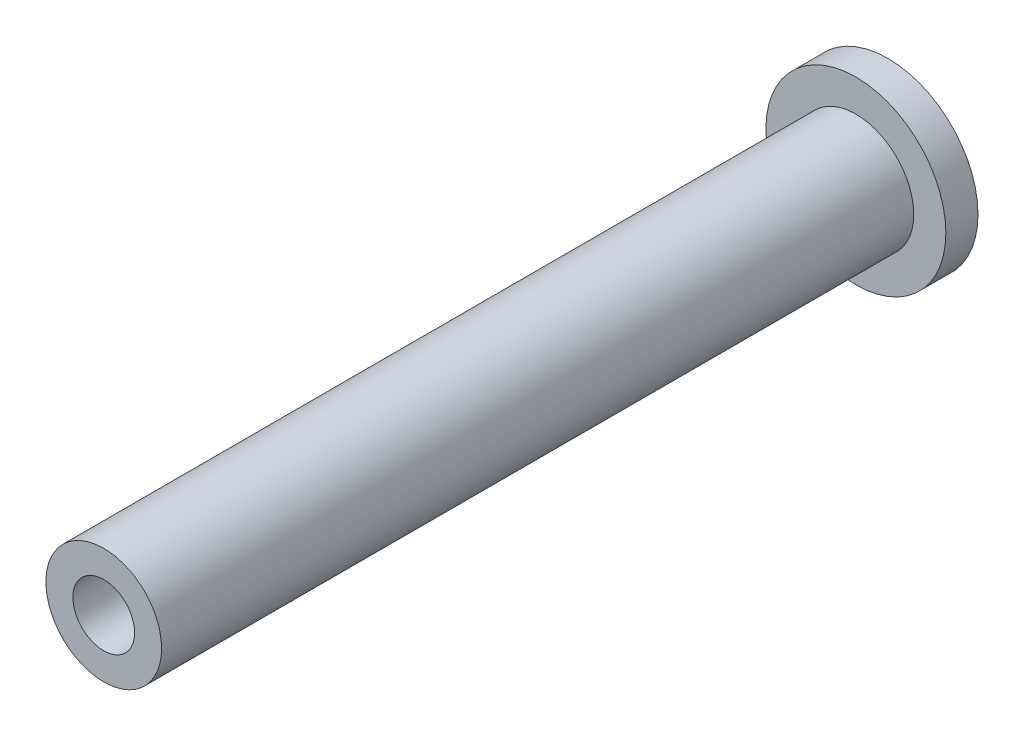
ISO-10303-21;
HEADER;
FILE_DESCRIPTION(('STEP AP214'),'2;1');
FILE_NAME('part.step','',(''),(''),'','','');
FILE_SCHEMA(('AUTOMOTIVE_DESIGN { 1 0 10303 214 1 1 1 1 }'));
ENDSEC;
DATA;
#1=APPLICATION_CONTEXT('core data for automotive mechanical design processes');
#2=APPLICATION_PROTOCOL_DEFINITION('international standard','automotive_design',2000,#1);
#3=PRODUCT_CONTEXT('',#1,'mechanical');
#4=PRODUCT('Part','Part','',(#3));
#5=PRODUCT_RELATED_PRODUCT_CATEGORY('part','',(#4));
#6=PRODUCT_DEFINITION_FORMATION('','',#4);
#7=PRODUCT_DEFINITION_CONTEXT('part definition',#1,'design');
#8=PRODUCT_DEFINITION('design','',#6,#7);
#9=PRODUCT_DEFINITION_SHAPE('','',#8);
#10=(LENGTH_UNIT() NAMED_UNIT(*) SI_UNIT(.MILLI.,.METRE.));
#11=(NAMED_UNIT(*) PLANE_ANGLE_UNIT() SI_UNIT($,.RADIAN.));
#12=(NAMED_UNIT(*) SI_UNIT($,.STERADIAN.) SOLID_ANGLE_UNIT());
#13=UNCERTAINTY_MEASURE_WITH_UNIT(LENGTH_MEASURE(1.E-05),#10,'distance_accuracy_value','');
#14=(GEOMETRIC_REPRESENTATION_CONTEXT(3) GLOBAL_UNCERTAINTY_ASSIGNED_CONTEXT((#13)) GLOBAL_UNIT_ASSIGNED_CONTEXT((#10,
#11,#12)) REPRESENTATION_CONTEXT('',''));
#15=CARTESIAN_POINT('',(0.,0.,0.));
#16=DIRECTION('',(0.,0.,1.));
#17=DIRECTION('',(1.,0.,0.));
#18=AXIS2_PLACEMENT_3D('',#15,#16,#17);
#19=CARTESIAN_POINT('',(0.,0.,2.5));
#20=DIRECTION('',(0.,0.,-1.));
#21=DIRECTION('',(-1.,0.,0.));
#22=AXIS2_PLACEMENT_3D('',#19,#20,#21);
#23=CYLINDRICAL_SURFACE('',#22,7.);
#24=CARTESIAN_POINT('',(0.,0.,2.5));
#25=DIRECTION('',(0.,0.,1.));
#26=DIRECTION('',(1.,0.,0.));
#27=AXIS2_PLACEMENT_3D('',#24,#25,#26);
#28=CIRCLE('',#27,7.);
#29=CARTESIAN_POINT('',(7.,0.,2.5));
#30=VERTEX_POINT('',#29);
#31=EDGE_CURVE('E39',#30,#30,#28,.T.);
#32=ORIENTED_EDGE('',*,*,#31,.F.);
#33=EDGE_LOOP('',(#32));
#34=FACE_BOUND('',#33,.T.);
#35=CARTESIAN_POINT('',(0.,0.,0.));
#36=DIRECTION('',(0.,0.,1.));
#37=DIRECTION('',(1.,0.,0.));
#38=AXIS2_PLACEMENT_3D('',#35,#36,#37);
#39=CIRCLE('',#38,7.);
#40=CARTESIAN_POINT('',(7.,0.,0.));
#41=VERTEX_POINT('',#40);
#42=EDGE_CURVE('E35',#41,#41,#39,.T.);
#43=ORIENTED_EDGE('',*,*,#42,.T.);
#44=EDGE_LOOP('',(#43));
#45=FACE_BOUND('',#44,.T.);
#46=ADVANCED_FACE('F32',(#34,#45),#23,.T.);
#47=CARTESIAN_POINT('',(0.,0.,2.5));
#48=DIRECTION('',(0.,0.,1.));
#49=DIRECTION('',(1.,0.,0.));
#50=AXIS2_PLACEMENT_3D('',#47,#48,#49);
#51=PLANE('',#50);
#52=CARTESIAN_POINT('',(0.,0.,2.5));
#53=DIRECTION('',(0.,0.,1.));
#54=DIRECTION('',(1.,0.,0.));
#55=AXIS2_PLACEMENT_3D('',#52,#53,#54);
#56=CIRCLE('',#55,4.5);
#57=CARTESIAN_POINT('',(4.5,0.,2.5));
#58=VERTEX_POINT('',#57);
#59=EDGE_CURVE('E10',#58,#58,#56,.T.);
#60=ORIENTED_EDGE('',*,*,#59,.F.);
#61=EDGE_LOOP('',(#60));
#62=FACE_BOUND('',#61,.T.);
#63=ORIENTED_EDGE('',*,*,#31,.T.);
#64=EDGE_LOOP('',(#63));
#65=FACE_BOUND('',#64,.T.);
#66=ADVANCED_FACE('F76',(#62,#65),#51,.T.);
#67=CARTESIAN_POINT('',(0.,0.,0.));
#68=DIRECTION('',(0.,0.,1.));
#69=DIRECTION('',(1.,0.,0.));
#70=AXIS2_PLACEMENT_3D('',#67,#68,#69);
#71=PLANE('',#70);
#72=ORIENTED_EDGE('',*,*,#42,.F.);
#73=EDGE_LOOP('',(#72));
#74=FACE_BOUND('',#73,.T.);
#75=ADVANCED_FACE('F71',(#74),#71,.F.);
#76=CARTESIAN_POINT('',(0.,0.,61.));
#77=DIRECTION('',(0.,0.,-1.));
#78=DIRECTION('',(-1.,0.,0.));
#79=AXIS2_PLACEMENT_3D('',#76,#77,#78);
#80=CYLINDRICAL_SURFACE('',#79,4.5);
#81=CARTESIAN_POINT('',(0.,0.,61.));
#82=DIRECTION('',(0.,0.,1.));
#83=DIRECTION('',(1.,0.,0.));
#84=AXIS2_PLACEMENT_3D('',#81,#82,#83);
#85=CIRCLE('',#84,4.5);
#86=CARTESIAN_POINT('',(4.5,0.,61.));
#87=VERTEX_POINT('',#86);
#88=EDGE_CURVE('E45',#87,#87,#85,.T.);
#89=ORIENTED_EDGE('',*,*,#88,.F.);
#90=EDGE_LOOP('',(#89));
#91=FACE_BOUND('',#90,.T.);
#92=ORIENTED_EDGE('',*,*,#59,.T.);
#93=EDGE_LOOP('',(#92));
#94=FACE_BOUND('',#93,.T.);
#95=ADVANCED_FACE('F66',(#91,#94),#80,.T.);
#96=CARTESIAN_POINT('',(0.,0.,61.));
#97=DIRECTION('',(0.,0.,1.));
#98=DIRECTION('',(1.,0.,0.));
#99=AXIS2_PLACEMENT_3D('',#96,#97,#98);
#100=PLANE('',#99);
#101=CARTESIAN_POINT('',(0.,0.,61.));
#102=DIRECTION('',(0.,0.,1.));
#103=DIRECTION('',(1.,0.,0.));
#104=AXIS2_PLACEMENT_3D('',#101,#102,#103);
#105=CIRCLE('',#104,2.4);
#106=CARTESIAN_POINT('',(2.4,0.,61.));
#107=VERTEX_POINT('',#106);
#108=EDGE_CURVE('E49',#107,#107,#105,.T.);
#109=ORIENTED_EDGE('',*,*,#108,.F.);
#110=EDGE_LOOP('',(#109));
#111=FACE_BOUND('',#110,.T.);
#112=ORIENTED_EDGE('',*,*,#88,.T.);
#113=EDGE_LOOP('',(#112));
#114=FACE_BOUND('',#113,.T.);
#115=ADVANCED_FACE('F60',(#111,#114),#100,.T.);
#116=CARTESIAN_POINT('',(0.,0.,56.));
#117=DIRECTION('',(0.,0.,1.));
#118=DIRECTION('',(1.,0.,0.));
#119=AXIS2_PLACEMENT_3D('',#116,#117,#118);
#120=CYLINDRICAL_SURFACE('',#119,2.4);
#121=CARTESIAN_POINT('',(0.,0.,56.));
#122=DIRECTION('',(0.,0.,1.));
#123=DIRECTION('',(1.,0.,0.));
#124=AXIS2_PLACEMENT_3D('',#121,#122,#123);
#125=CIRCLE('',#124,2.4);
#126=CARTESIAN_POINT('',(2.4,0.,56.));
#127=VERTEX_POINT('',#126);
#128=EDGE_CURVE('E48',#127,#127,#125,.T.);
#129=ORIENTED_EDGE('',*,*,#128,.F.);
#130=EDGE_LOOP('',(#129));
#131=FACE_BOUND('',#130,.T.);
#132=ORIENTED_EDGE('',*,*,#108,.T.);
#133=EDGE_LOOP('',(#132));
#134=FACE_BOUND('',#133,.T.);
#135=ADVANCED_FACE('F57',(#131,#134),#120,.F.);
#136=CARTESIAN_POINT('',(0.,0.,56.));
#137=DIRECTION('',(0.,0.,1.));
#138=DIRECTION('',(1.,0.,0.));
#139=AXIS2_PLACEMENT_3D('',#136,#137,#138);
#140=PLANE('',#139);
#141=ORIENTED_EDGE('',*,*,#128,.T.);
#142=EDGE_LOOP('',(#141));
#143=FACE_BOUND('',#142,.T.);
#144=ADVANCED_FACE('F55',(#143),#140,.T.);
#145=CLOSED_SHELL('',(#46,#66,#75,#95,#115,#135,#144));
#146=MANIFOLD_SOLID_BREP('B2',#145);
#147=ADVANCED_BREP_SHAPE_REPRESENTATION('',(#18,#146),#14);
#148=SHAPE_DEFINITION_REPRESENTATION(#9,#147);
ENDSEC;
END-ISO-10303-21;
